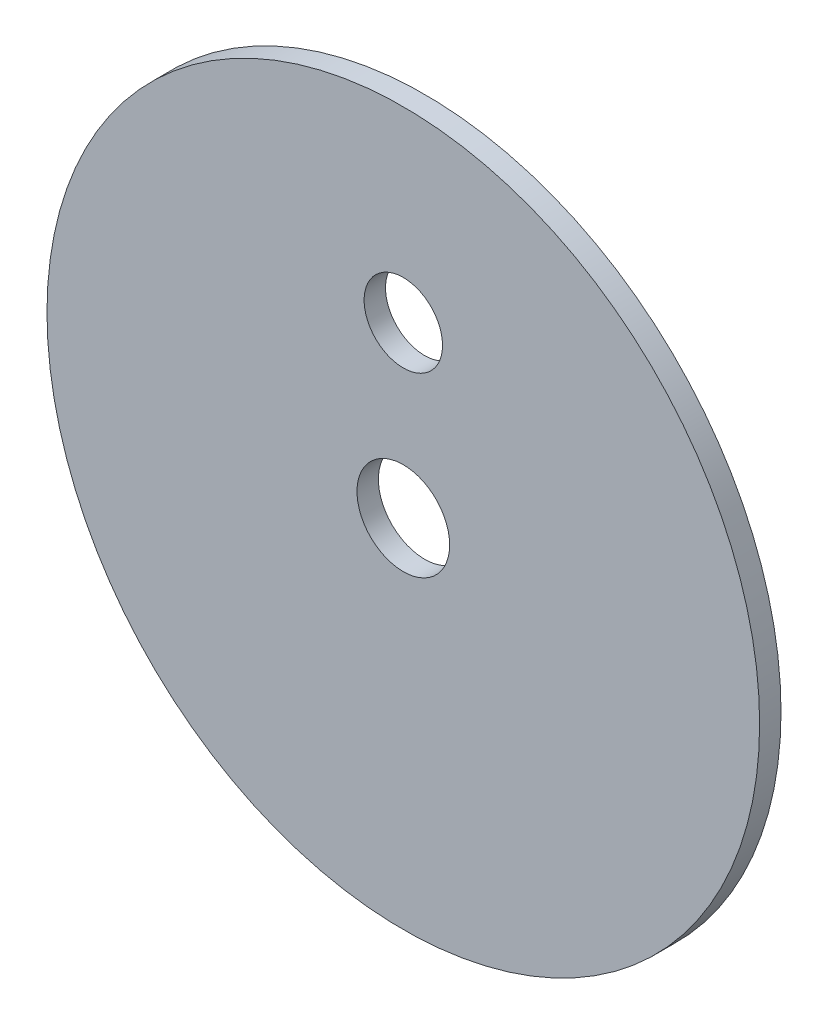
ISO-10303-21;
HEADER;
FILE_DESCRIPTION(('STEP AP214'),'2;1');
FILE_NAME('part.step','',(''),(''),'','','');
FILE_SCHEMA(('AUTOMOTIVE_DESIGN { 1 0 10303 214 1 1 1 1 }'));
ENDSEC;
DATA;
#1=APPLICATION_CONTEXT('core data for automotive mechanical design processes');
#2=APPLICATION_PROTOCOL_DEFINITION('international standard','automotive_design',2000,#1);
#3=PRODUCT_CONTEXT('',#1,'mechanical');
#4=PRODUCT('Part','Part','',(#3));
#5=PRODUCT_RELATED_PRODUCT_CATEGORY('part','',(#4));
#6=PRODUCT_DEFINITION_FORMATION('','',#4);
#7=PRODUCT_DEFINITION_CONTEXT('part definition',#1,'design');
#8=PRODUCT_DEFINITION('design','',#6,#7);
#9=PRODUCT_DEFINITION_SHAPE('','',#8);
#10=(LENGTH_UNIT() NAMED_UNIT(*) SI_UNIT(.MILLI.,.METRE.));
#11=(NAMED_UNIT(*) PLANE_ANGLE_UNIT() SI_UNIT($,.RADIAN.));
#12=(NAMED_UNIT(*) SI_UNIT($,.STERADIAN.) SOLID_ANGLE_UNIT());
#13=UNCERTAINTY_MEASURE_WITH_UNIT(LENGTH_MEASURE(1.E-05),#10,'distance_accuracy_value','');
#14=(GEOMETRIC_REPRESENTATION_CONTEXT(3) GLOBAL_UNCERTAINTY_ASSIGNED_CONTEXT((#13)) GLOBAL_UNIT_ASSIGNED_CONTEXT((#10,
#11,#12)) REPRESENTATION_CONTEXT('',''));
#15=CARTESIAN_POINT('',(0.,0.,0.));
#16=DIRECTION('',(0.,0.,1.));
#17=DIRECTION('',(1.,0.,0.));
#18=AXIS2_PLACEMENT_3D('',#15,#16,#17);
#19=CARTESIAN_POINT('',(0.,0.,3.));
#20=DIRECTION('',(0.,0.,-1.));
#21=DIRECTION('',(-1.,0.,0.));
#22=AXIS2_PLACEMENT_3D('',#19,#20,#21);
#23=CYLINDRICAL_SURFACE('',#22,50.);
#24=CARTESIAN_POINT('',(0.,0.,3.));
#25=DIRECTION('',(0.,0.,1.));
#26=DIRECTION('',(1.,0.,0.));
#27=AXIS2_PLACEMENT_3D('',#24,#25,#26);
#28=CIRCLE('',#27,50.);
#29=CARTESIAN_POINT('',(50.,0.,3.));
#30=VERTEX_POINT('',#29);
#31=EDGE_CURVE('E12',#30,#30,#28,.T.);
#32=ORIENTED_EDGE('',*,*,#31,.F.);
#33=EDGE_LOOP('',(#32));
#34=FACE_BOUND('',#33,.T.);
#35=CARTESIAN_POINT('',(0.,0.,0.));
#36=DIRECTION('',(0.,0.,1.));
#37=DIRECTION('',(1.,0.,0.));
#38=AXIS2_PLACEMENT_3D('',#35,#36,#37);
#39=CIRCLE('',#38,50.);
#40=CARTESIAN_POINT('',(50.,0.,0.));
#41=VERTEX_POINT('',#40);
#42=EDGE_CURVE('E47',#41,#41,#39,.T.);
#43=ORIENTED_EDGE('',*,*,#42,.T.);
#44=EDGE_LOOP('',(#43));
#45=FACE_BOUND('',#44,.T.);
#46=ADVANCED_FACE('F44',(#34,#45),#23,.T.);
#47=CARTESIAN_POINT('',(0.,0.,3.));
#48=DIRECTION('',(0.,0.,1.));
#49=DIRECTION('',(1.,0.,0.));
#50=AXIS2_PLACEMENT_3D('',#47,#48,#49);
#51=PLANE('',#50);
#52=CARTESIAN_POINT('',(0.,0.,3.));
#53=DIRECTION('',(0.,0.,1.));
#54=DIRECTION('',(1.,0.,0.));
#55=AXIS2_PLACEMENT_3D('',#52,#53,#54);
#56=CIRCLE('',#55,6.5);
#57=CARTESIAN_POINT('',(6.5,0.,3.));
#58=VERTEX_POINT('',#57);
#59=EDGE_CURVE('E54',#58,#58,#56,.T.);
#60=ORIENTED_EDGE('',*,*,#59,.F.);
#61=EDGE_LOOP('',(#60));
#62=FACE_BOUND('',#61,.T.);
#63=CARTESIAN_POINT('',(0.,23.75,3.));
#64=DIRECTION('',(0.,0.,1.));
#65=DIRECTION('',(1.,0.,0.));
#66=AXIS2_PLACEMENT_3D('',#63,#64,#65);
#67=CIRCLE('',#66,5.5);
#68=CARTESIAN_POINT('',(5.5,23.75,3.));
#69=VERTEX_POINT('',#68);
#70=EDGE_CURVE('E58',#69,#69,#67,.T.);
#71=ORIENTED_EDGE('',*,*,#70,.F.);
#72=EDGE_LOOP('',(#71));
#73=FACE_BOUND('',#72,.T.);
#74=ORIENTED_EDGE('',*,*,#31,.T.);
#75=EDGE_LOOP('',(#74));
#76=FACE_BOUND('',#75,.T.);
#77=ADVANCED_FACE('F82',(#62,#73,#76),#51,.T.);
#78=CARTESIAN_POINT('',(0.,0.,0.));
#79=DIRECTION('',(0.,0.,1.));
#80=DIRECTION('',(1.,0.,0.));
#81=AXIS2_PLACEMENT_3D('',#78,#79,#80);
#82=PLANE('',#81);
#83=CARTESIAN_POINT('',(0.,0.,0.));
#84=DIRECTION('',(0.,0.,1.));
#85=DIRECTION('',(1.,0.,0.));
#86=AXIS2_PLACEMENT_3D('',#83,#84,#85);
#87=CIRCLE('',#86,6.5);
#88=CARTESIAN_POINT('',(6.5,0.,0.));
#89=VERTEX_POINT('',#88);
#90=EDGE_CURVE('E61',#89,#89,#87,.T.);
#91=ORIENTED_EDGE('',*,*,#90,.T.);
#92=EDGE_LOOP('',(#91));
#93=FACE_BOUND('',#92,.T.);
#94=CARTESIAN_POINT('',(0.,23.75,0.));
#95=DIRECTION('',(0.,0.,1.));
#96=DIRECTION('',(1.,0.,0.));
#97=AXIS2_PLACEMENT_3D('',#94,#95,#96);
#98=CIRCLE('',#97,5.5);
#99=CARTESIAN_POINT('',(5.5,23.75,0.));
#100=VERTEX_POINT('',#99);
#101=EDGE_CURVE('E62',#100,#100,#98,.T.);
#102=ORIENTED_EDGE('',*,*,#101,.T.);
#103=EDGE_LOOP('',(#102));
#104=FACE_BOUND('',#103,.T.);
#105=ORIENTED_EDGE('',*,*,#42,.F.);
#106=EDGE_LOOP('',(#105));
#107=FACE_BOUND('',#106,.T.);
#108=ADVANCED_FACE('F68',(#93,#104,#107),#82,.F.);
#109=CARTESIAN_POINT('',(0.,23.75,0.));
#110=DIRECTION('',(0.,0.,1.));
#111=DIRECTION('',(1.,0.,0.));
#112=AXIS2_PLACEMENT_3D('',#109,#110,#111);
#113=CYLINDRICAL_SURFACE('',#112,5.5);
#114=ORIENTED_EDGE('',*,*,#70,.T.);
#115=EDGE_LOOP('',(#114));
#116=FACE_BOUND('',#115,.T.);
#117=ORIENTED_EDGE('',*,*,#101,.F.);
#118=EDGE_LOOP('',(#117));
#119=FACE_BOUND('',#118,.T.);
#120=ADVANCED_FACE('F73',(#116,#119),#113,.F.);
#121=CARTESIAN_POINT('',(0.,0.,0.));
#122=DIRECTION('',(0.,0.,1.));
#123=DIRECTION('',(1.,0.,0.));
#124=AXIS2_PLACEMENT_3D('',#121,#122,#123);
#125=CYLINDRICAL_SURFACE('',#124,6.5);
#126=ORIENTED_EDGE('',*,*,#59,.T.);
#127=EDGE_LOOP('',(#126));
#128=FACE_BOUND('',#127,.T.);
#129=ORIENTED_EDGE('',*,*,#90,.F.);
#130=EDGE_LOOP('',(#129));
#131=FACE_BOUND('',#130,.T.);
#132=ADVANCED_FACE('F71',(#128,#131),#125,.F.);
#133=CLOSED_SHELL('',(#46,#77,#108,#120,#132));
#134=MANIFOLD_SOLID_BREP('B2',#133);
#135=ADVANCED_BREP_SHAPE_REPRESENTATION('',(#18,#134),#14);
#136=SHAPE_DEFINITION_REPRESENTATION(#9,#135);
ENDSEC;
END-ISO-10303-21;
